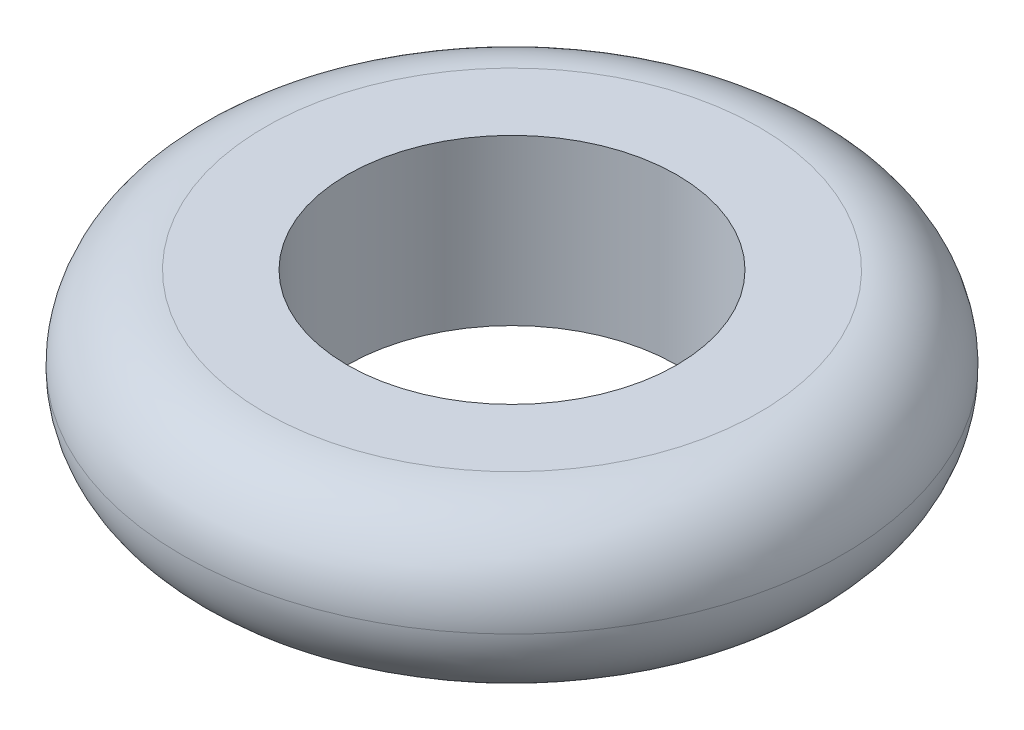
ISO-10303-21;
HEADER;
FILE_DESCRIPTION(('STEP AP214'),'2;1');
FILE_NAME('part.step','',(''),(''),'','','');
FILE_SCHEMA(('AUTOMOTIVE_DESIGN { 1 0 10303 214 1 1 1 1 }'));
ENDSEC;
DATA;
#1=APPLICATION_CONTEXT('core data for automotive mechanical design processes');
#2=APPLICATION_PROTOCOL_DEFINITION('international standard','automotive_design',2000,#1);
#3=PRODUCT_CONTEXT('',#1,'mechanical');
#4=PRODUCT('Part','Part','',(#3));
#5=PRODUCT_RELATED_PRODUCT_CATEGORY('part','',(#4));
#6=PRODUCT_DEFINITION_FORMATION('','',#4);
#7=PRODUCT_DEFINITION_CONTEXT('part definition',#1,'design');
#8=PRODUCT_DEFINITION('design','',#6,#7);
#9=PRODUCT_DEFINITION_SHAPE('','',#8);
#10=(LENGTH_UNIT() NAMED_UNIT(*) SI_UNIT(.MILLI.,.METRE.));
#11=(NAMED_UNIT(*) PLANE_ANGLE_UNIT() SI_UNIT($,.RADIAN.));
#12=(NAMED_UNIT(*) SI_UNIT($,.STERADIAN.) SOLID_ANGLE_UNIT());
#13=UNCERTAINTY_MEASURE_WITH_UNIT(LENGTH_MEASURE(1.E-05),#10,'distance_accuracy_value','');
#14=(GEOMETRIC_REPRESENTATION_CONTEXT(3) GLOBAL_UNCERTAINTY_ASSIGNED_CONTEXT((#13)) GLOBAL_UNIT_ASSIGNED_CONTEXT((#10,
#11,#12)) REPRESENTATION_CONTEXT('',''));
#15=CARTESIAN_POINT('',(0.,0.,0.));
#16=DIRECTION('',(0.,0.,1.));
#17=DIRECTION('',(1.,0.,0.));
#18=AXIS2_PLACEMENT_3D('',#15,#16,#17);
#19=CARTESIAN_POINT('',(-1.00537162625958,1.,-0.377014359847341));
#20=DIRECTION('',(0.,1.,0.));
#21=DIRECTION('',(0.,0.,1.));
#22=AXIS2_PLACEMENT_3D('',#19,#20,#21);
#23=PLANE('',#22);
#24=CARTESIAN_POINT('',(-1.00537162625958,1.,-0.377014359847341));
#25=DIRECTION('',(0.,1.,0.));
#26=DIRECTION('',(0.,0.,1.));
#27=AXIS2_PLACEMENT_3D('',#24,#25,#26);
#28=CIRCLE('',#27,1.5);
#29=CARTESIAN_POINT('',(-1.00537162625958,1.,1.12298564015266));
#30=VERTEX_POINT('',#29);
#31=EDGE_CURVE('E10',#30,#30,#28,.T.);
#32=ORIENTED_EDGE('',*,*,#31,.T.);
#33=EDGE_LOOP('',(#32));
#34=FACE_BOUND('',#33,.T.);
#35=CARTESIAN_POINT('',(-1.00537162625958,1.,-0.377014359847341));
#36=DIRECTION('',(0.,1.,0.));
#37=DIRECTION('',(0.,0.,1.));
#38=AXIS2_PLACEMENT_3D('',#35,#36,#37);
#39=CIRCLE('',#38,1.);
#40=CARTESIAN_POINT('',(-1.00537162625958,1.,0.62298564015266));
#41=VERTEX_POINT('',#40);
#42=EDGE_CURVE('E42',#41,#41,#39,.T.);
#43=ORIENTED_EDGE('',*,*,#42,.F.);
#44=EDGE_LOOP('',(#43));
#45=FACE_BOUND('',#44,.T.);
#46=ADVANCED_FACE('F30',(#34,#45),#23,.T.);
#47=CARTESIAN_POINT('',(-1.00537162625958,0.,-0.377014359847341));
#48=DIRECTION('',(0.,1.,0.));
#49=DIRECTION('',(0.,0.,1.));
#50=AXIS2_PLACEMENT_3D('',#47,#48,#49);
#51=PLANE('',#50);
#52=CARTESIAN_POINT('',(-1.00537162625958,0.,-0.377014359847341));
#53=DIRECTION('',(0.,1.,0.));
#54=DIRECTION('',(0.,0.,1.));
#55=AXIS2_PLACEMENT_3D('',#52,#53,#54);
#56=CIRCLE('',#55,1.5);
#57=CARTESIAN_POINT('',(-1.00537162625958,0.,1.12298564015266));
#58=VERTEX_POINT('',#57);
#59=EDGE_CURVE('E38',#58,#58,#56,.F.);
#60=ORIENTED_EDGE('',*,*,#59,.T.);
#61=EDGE_LOOP('',(#60));
#62=FACE_BOUND('',#61,.T.);
#63=CARTESIAN_POINT('',(-1.00537162625958,0.,-0.377014359847341));
#64=DIRECTION('',(0.,1.,0.));
#65=DIRECTION('',(0.,0.,1.));
#66=AXIS2_PLACEMENT_3D('',#63,#64,#65);
#67=CIRCLE('',#66,1.);
#68=CARTESIAN_POINT('',(-1.00537162625958,0.,0.62298564015266));
#69=VERTEX_POINT('',#68);
#70=EDGE_CURVE('E45',#69,#69,#67,.T.);
#71=ORIENTED_EDGE('',*,*,#70,.T.);
#72=EDGE_LOOP('',(#71));
#73=FACE_BOUND('',#72,.T.);
#74=ADVANCED_FACE('F55',(#62,#73),#51,.F.);
#75=CARTESIAN_POINT('',(-1.00537162625958,1.,-0.377014359847341));
#76=DIRECTION('',(0.,-1.,0.));
#77=DIRECTION('',(0.,0.,-1.));
#78=AXIS2_PLACEMENT_3D('',#75,#76,#77);
#79=CYLINDRICAL_SURFACE('',#78,1.);
#80=ORIENTED_EDGE('',*,*,#42,.T.);
#81=EDGE_LOOP('',(#80));
#82=FACE_BOUND('',#81,.T.);
#83=ORIENTED_EDGE('',*,*,#70,.F.);
#84=EDGE_LOOP('',(#83));
#85=FACE_BOUND('',#84,.T.);
#86=ADVANCED_FACE('F51',(#82,#85),#79,.F.);
#87=CARTESIAN_POINT('',(-1.00537162625958,0.5,-0.377014359847341));
#88=DIRECTION('',(0.,1.,0.));
#89=DIRECTION('',(0.,0.,1.));
#90=AXIS2_PLACEMENT_3D('',#87,#88,#89);
#91=TOROIDAL_SURFACE('',#90,1.5,0.5);
#92=ORIENTED_EDGE('',*,*,#31,.F.);
#93=EDGE_LOOP('',(#92));
#94=FACE_BOUND('',#93,.T.);
#95=CARTESIAN_POINT('',(-1.00537162625958,0.5,-0.377014359847341));
#96=DIRECTION('',(0.,1.,0.));
#97=DIRECTION('',(0.,0.,1.));
#98=AXIS2_PLACEMENT_3D('',#95,#96,#97);
#99=CIRCLE('',#98,2.);
#100=CARTESIAN_POINT('',(-1.00537162625958,0.5,1.62298564015266));
#101=VERTEX_POINT('',#100);
#102=EDGE_CURVE('E34',#101,#101,#99,.F.);
#103=ORIENTED_EDGE('',*,*,#102,.F.);
#104=EDGE_LOOP('',(#103));
#105=FACE_BOUND('',#104,.T.);
#106=ADVANCED_FACE('F32',(#94,#105),#91,.T.);
#107=CARTESIAN_POINT('',(-1.00537162625958,0.5,-0.377014359847341));
#108=DIRECTION('',(0.,1.,0.));
#109=DIRECTION('',(0.,0.,1.));
#110=AXIS2_PLACEMENT_3D('',#107,#108,#109);
#111=TOROIDAL_SURFACE('',#110,1.5,0.5);
#112=ORIENTED_EDGE('',*,*,#59,.F.);
#113=EDGE_LOOP('',(#112));
#114=FACE_BOUND('',#113,.T.);
#115=ORIENTED_EDGE('',*,*,#102,.T.);
#116=EDGE_LOOP('',(#115));
#117=FACE_BOUND('',#116,.T.);
#118=ADVANCED_FACE('F63',(#114,#117),#111,.T.);
#119=CLOSED_SHELL('',(#46,#74,#86,#106,#118));
#120=MANIFOLD_SOLID_BREP('B2',#119);
#121=ADVANCED_BREP_SHAPE_REPRESENTATION('',(#18,#120),#14);
#122=SHAPE_DEFINITION_REPRESENTATION(#9,#121);
ENDSEC;
END-ISO-10303-21;
